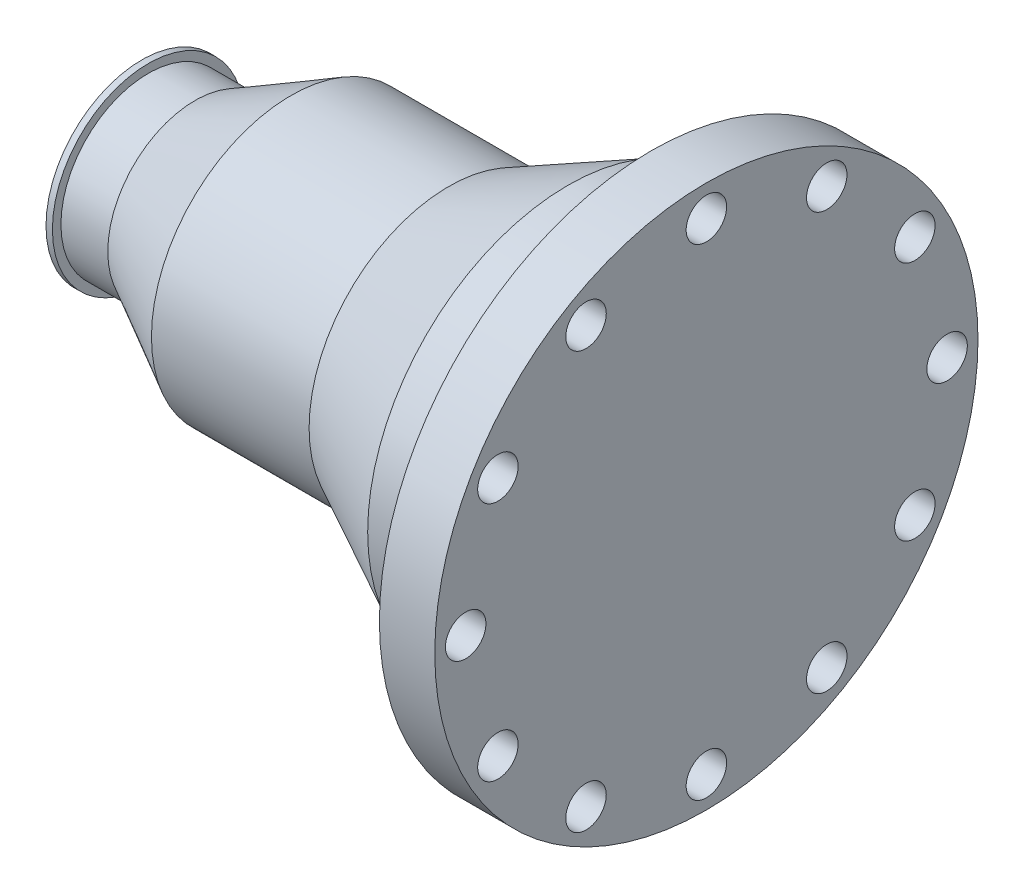
ISO-10303-21;
HEADER;
FILE_DESCRIPTION(('STEP AP214'),'2;1');
FILE_NAME('part.step','',(''),(''),'','','');
FILE_SCHEMA(('AUTOMOTIVE_DESIGN { 1 0 10303 214 1 1 1 1 }'));
ENDSEC;
DATA;
#1=APPLICATION_CONTEXT('core data for automotive mechanical design processes');
#2=APPLICATION_PROTOCOL_DEFINITION('international standard','automotive_design',2000,#1);
#3=PRODUCT_CONTEXT('',#1,'mechanical');
#4=PRODUCT('Part','Part','',(#3));
#5=PRODUCT_RELATED_PRODUCT_CATEGORY('part','',(#4));
#6=PRODUCT_DEFINITION_FORMATION('','',#4);
#7=PRODUCT_DEFINITION_CONTEXT('part definition',#1,'design');
#8=PRODUCT_DEFINITION('design','',#6,#7);
#9=PRODUCT_DEFINITION_SHAPE('','',#8);
#10=(LENGTH_UNIT() NAMED_UNIT(*) SI_UNIT(.MILLI.,.METRE.));
#11=(NAMED_UNIT(*) PLANE_ANGLE_UNIT() SI_UNIT($,.RADIAN.));
#12=(NAMED_UNIT(*) SI_UNIT($,.STERADIAN.) SOLID_ANGLE_UNIT());
#13=UNCERTAINTY_MEASURE_WITH_UNIT(LENGTH_MEASURE(1.E-05),#10,'distance_accuracy_value','');
#14=(GEOMETRIC_REPRESENTATION_CONTEXT(3) GLOBAL_UNCERTAINTY_ASSIGNED_CONTEXT((#13)) GLOBAL_UNIT_ASSIGNED_CONTEXT((#10,
#11,#12)) REPRESENTATION_CONTEXT('',''));
#15=CARTESIAN_POINT('',(0.,0.,0.));
#16=DIRECTION('',(0.,0.,1.));
#17=DIRECTION('',(1.,0.,0.));
#18=AXIS2_PLACEMENT_3D('',#15,#16,#17);
#19=CARTESIAN_POINT('',(0.,0.,0.));
#20=DIRECTION('',(1.,0.,0.));
#21=DIRECTION('',(0.,0.,-1.));
#22=AXIS2_PLACEMENT_3D('',#19,#20,#21);
#23=PLANE('',#22);
#24=CARTESIAN_POINT('',(0.,0.,0.));
#25=DIRECTION('',(-1.,0.,0.));
#26=DIRECTION('',(0.,0.,1.));
#27=AXIS2_PLACEMENT_3D('',#24,#25,#26);
#28=CIRCLE('',#27,31.);
#29=CARTESIAN_POINT('',(0.,0.,31.));
#30=VERTEX_POINT('',#29);
#31=EDGE_CURVE('E80',#30,#30,#28,.T.);
#32=ORIENTED_EDGE('',*,*,#31,.F.);
#33=EDGE_LOOP('',(#32));
#34=FACE_BOUND('',#33,.T.);
#35=CARTESIAN_POINT('',(0.,0.,0.));
#36=DIRECTION('',(-1.,0.,0.));
#37=DIRECTION('',(0.,0.,1.));
#38=AXIS2_PLACEMENT_3D('',#35,#36,#37);
#39=CIRCLE('',#38,45.);
#40=CARTESIAN_POINT('',(0.,0.,45.));
#41=VERTEX_POINT('',#40);
#42=EDGE_CURVE('E10',#41,#41,#39,.T.);
#43=ORIENTED_EDGE('',*,*,#42,.T.);
#44=EDGE_LOOP('',(#43));
#45=FACE_BOUND('',#44,.T.);
#46=ADVANCED_FACE('F37',(#34,#45),#23,.F.);
#47=CARTESIAN_POINT('',(0.,0.,0.));
#48=DIRECTION('',(-1.,0.,0.));
#49=DIRECTION('',(0.,0.,1.));
#50=AXIS2_PLACEMENT_3D('',#47,#48,#49);
#51=CYLINDRICAL_SURFACE('',#50,45.);
#52=ORIENTED_EDGE('',*,*,#42,.F.);
#53=EDGE_LOOP('',(#52));
#54=FACE_BOUND('',#53,.T.);
#55=CARTESIAN_POINT('',(3.,0.,0.));
#56=DIRECTION('',(-1.,0.,0.));
#57=DIRECTION('',(0.,0.,1.));
#58=AXIS2_PLACEMENT_3D('',#55,#56,#57);
#59=CIRCLE('',#58,45.);
#60=CARTESIAN_POINT('',(3.,0.,45.));
#61=VERTEX_POINT('',#60);
#62=EDGE_CURVE('E43',#61,#61,#59,.T.);
#63=ORIENTED_EDGE('',*,*,#62,.T.);
#64=EDGE_LOOP('',(#63));
#65=FACE_BOUND('',#64,.T.);
#66=ADVANCED_FACE('F244',(#54,#65),#51,.T.);
#67=CARTESIAN_POINT('',(3.,45.,0.));
#68=DIRECTION('',(-1.,0.,0.));
#69=DIRECTION('',(0.,0.,1.));
#70=AXIS2_PLACEMENT_3D('',#67,#68,#69);
#71=PLANE('',#70);
#72=ORIENTED_EDGE('',*,*,#62,.F.);
#73=EDGE_LOOP('',(#72));
#74=FACE_BOUND('',#73,.T.);
#75=CARTESIAN_POINT('',(3.,0.,0.));
#76=DIRECTION('',(-1.,0.,0.));
#77=DIRECTION('',(0.,0.,1.));
#78=AXIS2_PLACEMENT_3D('',#75,#76,#77);
#79=CIRCLE('',#78,41.);
#80=CARTESIAN_POINT('',(3.,0.,41.));
#81=VERTEX_POINT('',#80);
#82=EDGE_CURVE('E47',#81,#81,#79,.T.);
#83=ORIENTED_EDGE('',*,*,#82,.T.);
#84=EDGE_LOOP('',(#83));
#85=FACE_BOUND('',#84,.T.);
#86=ADVANCED_FACE('F250',(#74,#85),#71,.F.);
#87=CARTESIAN_POINT('',(0.,0.,0.));
#88=DIRECTION('',(-1.,0.,0.));
#89=DIRECTION('',(0.,0.,1.));
#90=AXIS2_PLACEMENT_3D('',#87,#88,#89);
#91=CYLINDRICAL_SURFACE('',#90,41.);
#92=ORIENTED_EDGE('',*,*,#82,.F.);
#93=EDGE_LOOP('',(#92));
#94=FACE_BOUND('',#93,.T.);
#95=CARTESIAN_POINT('',(25.,0.,0.));
#96=DIRECTION('',(-1.,0.,0.));
#97=DIRECTION('',(0.,0.,1.));
#98=AXIS2_PLACEMENT_3D('',#95,#96,#97);
#99=CIRCLE('',#98,41.);
#100=CARTESIAN_POINT('',(25.,0.,41.));
#101=VERTEX_POINT('',#100);
#102=EDGE_CURVE('E51',#101,#101,#99,.T.);
#103=ORIENTED_EDGE('',*,*,#102,.T.);
#104=EDGE_LOOP('',(#103));
#105=FACE_BOUND('',#104,.T.);
#106=ADVANCED_FACE('F604',(#94,#105),#91,.T.);
#107=CARTESIAN_POINT('',(70.,0.,0.));
#108=DIRECTION('',(1.,0.,0.));
#109=DIRECTION('',(0.,0.,-1.));
#110=AXIS2_PLACEMENT_3D('',#107,#108,#109);
#111=CONICAL_SURFACE('',#110,65.5,0.498567905638218);
#112=ORIENTED_EDGE('',*,*,#102,.F.);
#113=EDGE_LOOP('',(#112));
#114=FACE_BOUND('',#113,.T.);
#115=CARTESIAN_POINT('',(70.,0.,0.));
#116=DIRECTION('',(-1.,0.,0.));
#117=DIRECTION('',(0.,0.,1.));
#118=AXIS2_PLACEMENT_3D('',#115,#116,#117);
#119=CIRCLE('',#118,65.5);
#120=CARTESIAN_POINT('',(70.,0.,65.5));
#121=VERTEX_POINT('',#120);
#122=EDGE_CURVE('E56',#121,#121,#119,.T.);
#123=ORIENTED_EDGE('',*,*,#122,.T.);
#124=EDGE_LOOP('',(#123));
#125=FACE_BOUND('',#124,.T.);
#126=ADVANCED_FACE('F595',(#114,#125),#111,.T.);
#127=CARTESIAN_POINT('',(0.,0.,0.));
#128=DIRECTION('',(-1.,0.,0.));
#129=DIRECTION('',(0.,0.,1.));
#130=AXIS2_PLACEMENT_3D('',#127,#128,#129);
#131=CYLINDRICAL_SURFACE('',#130,65.5);
#132=ORIENTED_EDGE('',*,*,#122,.F.);
#133=EDGE_LOOP('',(#132));
#134=FACE_BOUND('',#133,.T.);
#135=CARTESIAN_POINT('',(144.,0.,0.));
#136=DIRECTION('',(-1.,0.,0.));
#137=DIRECTION('',(0.,0.,1.));
#138=AXIS2_PLACEMENT_3D('',#135,#136,#137);
#139=CIRCLE('',#138,65.5);
#140=CARTESIAN_POINT('',(144.,0.,65.5));
#141=VERTEX_POINT('',#140);
#142=EDGE_CURVE('E59',#141,#141,#139,.T.);
#143=ORIENTED_EDGE('',*,*,#142,.T.);
#144=EDGE_LOOP('',(#143));
#145=FACE_BOUND('',#144,.T.);
#146=ADVANCED_FACE('F586',(#134,#145),#131,.T.);
#147=CARTESIAN_POINT('',(200.,0.,0.));
#148=DIRECTION('',(1.,0.,0.));
#149=DIRECTION('',(0.,0.,-1.));
#150=AXIS2_PLACEMENT_3D('',#147,#148,#149);
#151=CONICAL_SURFACE('',#150,94.,0.470764926542016);
#152=ORIENTED_EDGE('',*,*,#142,.F.);
#153=EDGE_LOOP('',(#152));
#154=FACE_BOUND('',#153,.T.);
#155=CARTESIAN_POINT('',(200.,0.,0.));
#156=DIRECTION('',(-1.,0.,0.));
#157=DIRECTION('',(0.,0.,1.));
#158=AXIS2_PLACEMENT_3D('',#155,#156,#157);
#159=CIRCLE('',#158,94.);
#160=CARTESIAN_POINT('',(200.,0.,94.));
#161=VERTEX_POINT('',#160);
#162=EDGE_CURVE('E62',#161,#161,#159,.T.);
#163=ORIENTED_EDGE('',*,*,#162,.T.);
#164=EDGE_LOOP('',(#163));
#165=FACE_BOUND('',#164,.T.);
#166=ADVANCED_FACE('F577',(#154,#165),#151,.T.);
#167=CARTESIAN_POINT('',(0.,0.,0.));
#168=DIRECTION('',(-1.,0.,0.));
#169=DIRECTION('',(0.,0.,1.));
#170=AXIS2_PLACEMENT_3D('',#167,#168,#169);
#171=CYLINDRICAL_SURFACE('',#170,94.);
#172=ORIENTED_EDGE('',*,*,#162,.F.);
#173=EDGE_LOOP('',(#172));
#174=FACE_BOUND('',#173,.T.);
#175=CARTESIAN_POINT('',(220.,0.,0.));
#176=DIRECTION('',(-1.,0.,0.));
#177=DIRECTION('',(0.,0.,1.));
#178=AXIS2_PLACEMENT_3D('',#175,#176,#177);
#179=CIRCLE('',#178,94.);
#180=CARTESIAN_POINT('',(220.,0.,94.));
#181=VERTEX_POINT('',#180);
#182=EDGE_CURVE('E65',#181,#181,#179,.T.);
#183=ORIENTED_EDGE('',*,*,#182,.T.);
#184=EDGE_LOOP('',(#183));
#185=FACE_BOUND('',#184,.T.);
#186=ADVANCED_FACE('F568',(#174,#185),#171,.T.);
#187=CARTESIAN_POINT('',(220.,94.,0.));
#188=DIRECTION('',(1.,0.,0.));
#189=DIRECTION('',(0.,0.,-1.));
#190=AXIS2_PLACEMENT_3D('',#187,#188,#189);
#191=PLANE('',#190);
#192=ORIENTED_EDGE('',*,*,#182,.F.);
#193=EDGE_LOOP('',(#192));
#194=FACE_BOUND('',#193,.T.);
#195=CARTESIAN_POINT('',(220.,0.,0.));
#196=DIRECTION('',(-1.,0.,0.));
#197=DIRECTION('',(0.,0.,1.));
#198=AXIS2_PLACEMENT_3D('',#195,#196,#197);
#199=CIRCLE('',#198,95.);
#200=CARTESIAN_POINT('',(220.,0.,95.));
#201=VERTEX_POINT('',#200);
#202=EDGE_CURVE('E68',#201,#201,#199,.T.);
#203=ORIENTED_EDGE('',*,*,#202,.T.);
#204=EDGE_LOOP('',(#203));
#205=FACE_BOUND('',#204,.T.);
#206=ADVANCED_FACE('F559',(#194,#205),#191,.F.);
#207=CARTESIAN_POINT('',(0.,0.,0.));
#208=DIRECTION('',(-1.,0.,0.));
#209=DIRECTION('',(0.,0.,1.));
#210=AXIS2_PLACEMENT_3D('',#207,#208,#209);
#211=CYLINDRICAL_SURFACE('',#210,95.);
#212=ORIENTED_EDGE('',*,*,#202,.F.);
#213=EDGE_LOOP('',(#212));
#214=FACE_BOUND('',#213,.T.);
#215=CARTESIAN_POINT('',(239.,0.,0.));
#216=DIRECTION('',(-1.,0.,0.));
#217=DIRECTION('',(0.,0.,1.));
#218=AXIS2_PLACEMENT_3D('',#215,#216,#217);
#219=CIRCLE('',#218,95.);
#220=CARTESIAN_POINT('',(239.,0.,95.));
#221=VERTEX_POINT('',#220);
#222=EDGE_CURVE('E71',#221,#221,#219,.T.);
#223=ORIENTED_EDGE('',*,*,#222,.T.);
#224=EDGE_LOOP('',(#223));
#225=FACE_BOUND('',#224,.T.);
#226=ADVANCED_FACE('F240',(#214,#225),#211,.T.);
#227=CARTESIAN_POINT('',(239.,100.,0.));
#228=DIRECTION('',(1.,0.,0.));
#229=DIRECTION('',(0.,0.,-1.));
#230=AXIS2_PLACEMENT_3D('',#227,#228,#229);
#231=PLANE('',#230);
#232=CARTESIAN_POINT('',(239.,97.8608706276416,-56.5));
#233=DIRECTION('',(1.,0.,0.));
#234=DIRECTION('',(0.,0.,-1.));
#235=AXIS2_PLACEMENT_3D('',#232,#233,#234);
#236=CIRCLE('',#235,9.50000000000001);
#237=CARTESIAN_POINT('',(239.,97.8608706276416,-66.));
#238=VERTEX_POINT('',#237);
#239=EDGE_CURVE('E191',#238,#238,#236,.F.);
#240=ORIENTED_EDGE('',*,*,#239,.F.);
#241=EDGE_LOOP('',(#240));
#242=FACE_BOUND('',#241,.T.);
#243=CARTESIAN_POINT('',(239.,56.4999999999999,-97.8608706276416));
#244=DIRECTION('',(1.,0.,0.));
#245=DIRECTION('',(0.,0.,-1.));
#246=AXIS2_PLACEMENT_3D('',#243,#244,#245);
#247=CIRCLE('',#246,9.5);
#248=CARTESIAN_POINT('',(239.,56.4999999999999,-107.360870627642));
#249=VERTEX_POINT('',#248);
#250=EDGE_CURVE('E185',#249,#249,#247,.F.);
#251=ORIENTED_EDGE('',*,*,#250,.F.);
#252=EDGE_LOOP('',(#251));
#253=FACE_BOUND('',#252,.T.);
#254=CARTESIAN_POINT('',(239.,0.,-113.));
#255=DIRECTION('',(1.,0.,0.));
#256=DIRECTION('',(0.,0.,-1.));
#257=AXIS2_PLACEMENT_3D('',#254,#255,#256);
#258=CIRCLE('',#257,9.49999999999999);
#259=CARTESIAN_POINT('',(239.,0.,-122.5));
#260=VERTEX_POINT('',#259);
#261=EDGE_CURVE('E179',#260,#260,#258,.F.);
#262=ORIENTED_EDGE('',*,*,#261,.F.);
#263=EDGE_LOOP('',(#262));
#264=FACE_BOUND('',#263,.T.);
#265=CARTESIAN_POINT('',(239.,-56.5,-97.8608706276415));
#266=DIRECTION('',(1.,0.,0.));
#267=DIRECTION('',(0.,0.,-1.));
#268=AXIS2_PLACEMENT_3D('',#265,#266,#267);
#269=CIRCLE('',#268,9.5);
#270=CARTESIAN_POINT('',(239.,-56.5,-107.360870627642));
#271=VERTEX_POINT('',#270);
#272=EDGE_CURVE('E173',#271,#271,#269,.F.);
#273=ORIENTED_EDGE('',*,*,#272,.F.);
#274=EDGE_LOOP('',(#273));
#275=FACE_BOUND('',#274,.T.);
#276=CARTESIAN_POINT('',(239.,-97.8608706276416,-56.5));
#277=DIRECTION('',(1.,0.,0.));
#278=DIRECTION('',(0.,0.,-1.));
#279=AXIS2_PLACEMENT_3D('',#276,#277,#278);
#280=CIRCLE('',#279,9.50000000000001);
#281=CARTESIAN_POINT('',(239.,-97.8608706276416,-66.));
#282=VERTEX_POINT('',#281);
#283=EDGE_CURVE('E167',#282,#282,#280,.F.);
#284=ORIENTED_EDGE('',*,*,#283,.F.);
#285=EDGE_LOOP('',(#284));
#286=FACE_BOUND('',#285,.T.);
#287=CARTESIAN_POINT('',(239.,-113.,0.));
#288=DIRECTION('',(1.,0.,0.));
#289=DIRECTION('',(0.,0.,-1.));
#290=AXIS2_PLACEMENT_3D('',#287,#288,#289);
#291=CIRCLE('',#290,9.49999999999998);
#292=CARTESIAN_POINT('',(239.,-113.,-9.49999999999998));
#293=VERTEX_POINT('',#292);
#294=EDGE_CURVE('E161',#293,#293,#291,.F.);
#295=ORIENTED_EDGE('',*,*,#294,.F.);
#296=EDGE_LOOP('',(#295));
#297=FACE_BOUND('',#296,.T.);
#298=CARTESIAN_POINT('',(239.,-97.8608706276415,56.5));
#299=DIRECTION('',(1.,0.,0.));
#300=DIRECTION('',(0.,0.,-1.));
#301=AXIS2_PLACEMENT_3D('',#298,#299,#300);
#302=CIRCLE('',#301,9.5);
#303=CARTESIAN_POINT('',(239.,-97.8608706276415,47.));
#304=VERTEX_POINT('',#303);
#305=EDGE_CURVE('E155',#304,#304,#302,.F.);
#306=ORIENTED_EDGE('',*,*,#305,.F.);
#307=EDGE_LOOP('',(#306));
#308=FACE_BOUND('',#307,.T.);
#309=CARTESIAN_POINT('',(239.,-56.5,97.8608706276416));
#310=DIRECTION('',(1.,0.,0.));
#311=DIRECTION('',(0.,0.,-1.));
#312=AXIS2_PLACEMENT_3D('',#309,#310,#311);
#313=CIRCLE('',#312,9.5);
#314=CARTESIAN_POINT('',(239.,-56.5,88.3608706276416));
#315=VERTEX_POINT('',#314);
#316=EDGE_CURVE('E149',#315,#315,#313,.F.);
#317=ORIENTED_EDGE('',*,*,#316,.F.);
#318=EDGE_LOOP('',(#317));
#319=FACE_BOUND('',#318,.T.);
#320=CARTESIAN_POINT('',(239.,0.,113.));
#321=DIRECTION('',(1.,0.,0.));
#322=DIRECTION('',(0.,0.,-1.));
#323=AXIS2_PLACEMENT_3D('',#320,#321,#322);
#324=CIRCLE('',#323,9.49999999999999);
#325=CARTESIAN_POINT('',(239.,0.,103.5));
#326=VERTEX_POINT('',#325);
#327=EDGE_CURVE('E143',#326,#326,#324,.F.);
#328=ORIENTED_EDGE('',*,*,#327,.F.);
#329=EDGE_LOOP('',(#328));
#330=FACE_BOUND('',#329,.T.);
#331=CARTESIAN_POINT('',(239.,56.5,97.8608706276416));
#332=DIRECTION('',(1.,0.,0.));
#333=DIRECTION('',(0.,0.,-1.));
#334=AXIS2_PLACEMENT_3D('',#331,#332,#333);
#335=CIRCLE('',#334,9.5);
#336=CARTESIAN_POINT('',(239.,56.5,88.3608706276416));
#337=VERTEX_POINT('',#336);
#338=EDGE_CURVE('E137',#337,#337,#335,.F.);
#339=ORIENTED_EDGE('',*,*,#338,.F.);
#340=EDGE_LOOP('',(#339));
#341=FACE_BOUND('',#340,.T.);
#342=CARTESIAN_POINT('',(239.,97.8608706276416,56.5));
#343=DIRECTION('',(1.,0.,0.));
#344=DIRECTION('',(0.,0.,-1.));
#345=AXIS2_PLACEMENT_3D('',#342,#343,#344);
#346=CIRCLE('',#345,9.5);
#347=CARTESIAN_POINT('',(239.,97.8608706276416,47.));
#348=VERTEX_POINT('',#347);
#349=EDGE_CURVE('E131',#348,#348,#346,.F.);
#350=ORIENTED_EDGE('',*,*,#349,.F.);
#351=EDGE_LOOP('',(#350));
#352=FACE_BOUND('',#351,.T.);
#353=CARTESIAN_POINT('',(239.,113.,0.));
#354=DIRECTION('',(1.,0.,0.));
#355=DIRECTION('',(0.,0.,-1.));
#356=AXIS2_PLACEMENT_3D('',#353,#354,#355);
#357=CIRCLE('',#356,9.50000000000001);
#358=CARTESIAN_POINT('',(239.,113.,-9.50000000000001));
#359=VERTEX_POINT('',#358);
#360=EDGE_CURVE('E125',#359,#359,#357,.F.);
#361=ORIENTED_EDGE('',*,*,#360,.F.);
#362=EDGE_LOOP('',(#361));
#363=FACE_BOUND('',#362,.T.);
#364=ORIENTED_EDGE('',*,*,#222,.F.);
#365=EDGE_LOOP('',(#364));
#366=FACE_BOUND('',#365,.T.);
#367=CARTESIAN_POINT('',(239.,0.,0.));
#368=DIRECTION('',(-1.,0.,0.));
#369=DIRECTION('',(0.,0.,1.));
#370=AXIS2_PLACEMENT_3D('',#367,#368,#369);
#371=CIRCLE('',#370,127.5);
#372=CARTESIAN_POINT('',(239.,0.,127.5));
#373=VERTEX_POINT('',#372);
#374=EDGE_CURVE('E74',#373,#373,#371,.T.);
#375=ORIENTED_EDGE('',*,*,#374,.T.);
#376=EDGE_LOOP('',(#375));
#377=FACE_BOUND('',#376,.T.);
#378=ADVANCED_FACE('F232',(#242,#253,#264,#275,#286,#297,#308,#319,#330,#341,#352,#363,#366,
#377),#231,.F.);
#379=CARTESIAN_POINT('',(0.,0.,0.));
#380=DIRECTION('',(-1.,0.,0.));
#381=DIRECTION('',(0.,0.,1.));
#382=AXIS2_PLACEMENT_3D('',#379,#380,#381);
#383=CYLINDRICAL_SURFACE('',#382,127.5);
#384=ORIENTED_EDGE('',*,*,#374,.F.);
#385=EDGE_LOOP('',(#384));
#386=FACE_BOUND('',#385,.T.);
#387=CARTESIAN_POINT('',(265.,0.,0.));
#388=DIRECTION('',(-1.,0.,0.));
#389=DIRECTION('',(0.,0.,1.));
#390=AXIS2_PLACEMENT_3D('',#387,#388,#389);
#391=CIRCLE('',#390,127.5);
#392=CARTESIAN_POINT('',(265.,0.,127.5));
#393=VERTEX_POINT('',#392);
#394=EDGE_CURVE('E77',#393,#393,#391,.T.);
#395=ORIENTED_EDGE('',*,*,#394,.T.);
#396=EDGE_LOOP('',(#395));
#397=FACE_BOUND('',#396,.T.);
#398=ADVANCED_FACE('F205',(#386,#397),#383,.T.);
#399=CARTESIAN_POINT('',(265.,127.5,0.));
#400=DIRECTION('',(-1.,0.,0.));
#401=DIRECTION('',(0.,0.,1.));
#402=AXIS2_PLACEMENT_3D('',#399,#400,#401);
#403=PLANE('',#402);
#404=CARTESIAN_POINT('',(265.,97.8608706276416,-56.5));
#405=DIRECTION('',(1.,0.,0.));
#406=DIRECTION('',(0.,0.,-1.));
#407=AXIS2_PLACEMENT_3D('',#404,#405,#406);
#408=CIRCLE('',#407,9.50000000000001);
#409=CARTESIAN_POINT('',(265.,97.8608706276416,-66.));
#410=VERTEX_POINT('',#409);
#411=EDGE_CURVE('E194',#410,#410,#408,.T.);
#412=ORIENTED_EDGE('',*,*,#411,.F.);
#413=EDGE_LOOP('',(#412));
#414=FACE_BOUND('',#413,.T.);
#415=CARTESIAN_POINT('',(265.,56.4999999999999,-97.8608706276416));
#416=DIRECTION('',(1.,0.,0.));
#417=DIRECTION('',(0.,0.,-1.));
#418=AXIS2_PLACEMENT_3D('',#415,#416,#417);
#419=CIRCLE('',#418,9.5);
#420=CARTESIAN_POINT('',(265.,56.4999999999999,-107.360870627642));
#421=VERTEX_POINT('',#420);
#422=EDGE_CURVE('E188',#421,#421,#419,.T.);
#423=ORIENTED_EDGE('',*,*,#422,.F.);
#424=EDGE_LOOP('',(#423));
#425=FACE_BOUND('',#424,.T.);
#426=CARTESIAN_POINT('',(265.,0.,-113.));
#427=DIRECTION('',(1.,0.,0.));
#428=DIRECTION('',(0.,0.,-1.));
#429=AXIS2_PLACEMENT_3D('',#426,#427,#428);
#430=CIRCLE('',#429,9.49999999999999);
#431=CARTESIAN_POINT('',(265.,0.,-122.5));
#432=VERTEX_POINT('',#431);
#433=EDGE_CURVE('E182',#432,#432,#430,.T.);
#434=ORIENTED_EDGE('',*,*,#433,.F.);
#435=EDGE_LOOP('',(#434));
#436=FACE_BOUND('',#435,.T.);
#437=CARTESIAN_POINT('',(265.,-56.5,-97.8608706276415));
#438=DIRECTION('',(1.,0.,0.));
#439=DIRECTION('',(0.,0.,-1.));
#440=AXIS2_PLACEMENT_3D('',#437,#438,#439);
#441=CIRCLE('',#440,9.5);
#442=CARTESIAN_POINT('',(265.,-56.5,-107.360870627642));
#443=VERTEX_POINT('',#442);
#444=EDGE_CURVE('E176',#443,#443,#441,.T.);
#445=ORIENTED_EDGE('',*,*,#444,.F.);
#446=EDGE_LOOP('',(#445));
#447=FACE_BOUND('',#446,.T.);
#448=CARTESIAN_POINT('',(265.,-97.8608706276416,-56.5));
#449=DIRECTION('',(1.,0.,0.));
#450=DIRECTION('',(0.,0.,-1.));
#451=AXIS2_PLACEMENT_3D('',#448,#449,#450);
#452=CIRCLE('',#451,9.50000000000001);
#453=CARTESIAN_POINT('',(265.,-97.8608706276416,-66.));
#454=VERTEX_POINT('',#453);
#455=EDGE_CURVE('E170',#454,#454,#452,.T.);
#456=ORIENTED_EDGE('',*,*,#455,.F.);
#457=EDGE_LOOP('',(#456));
#458=FACE_BOUND('',#457,.T.);
#459=CARTESIAN_POINT('',(265.,-113.,0.));
#460=DIRECTION('',(1.,0.,0.));
#461=DIRECTION('',(0.,0.,-1.));
#462=AXIS2_PLACEMENT_3D('',#459,#460,#461);
#463=CIRCLE('',#462,9.49999999999998);
#464=CARTESIAN_POINT('',(265.,-113.,-9.49999999999998));
#465=VERTEX_POINT('',#464);
#466=EDGE_CURVE('E164',#465,#465,#463,.T.);
#467=ORIENTED_EDGE('',*,*,#466,.F.);
#468=EDGE_LOOP('',(#467));
#469=FACE_BOUND('',#468,.T.);
#470=CARTESIAN_POINT('',(265.,-97.8608706276415,56.5));
#471=DIRECTION('',(1.,0.,0.));
#472=DIRECTION('',(0.,0.,-1.));
#473=AXIS2_PLACEMENT_3D('',#470,#471,#472);
#474=CIRCLE('',#473,9.5);
#475=CARTESIAN_POINT('',(265.,-97.8608706276415,47.));
#476=VERTEX_POINT('',#475);
#477=EDGE_CURVE('E158',#476,#476,#474,.T.);
#478=ORIENTED_EDGE('',*,*,#477,.F.);
#479=EDGE_LOOP('',(#478));
#480=FACE_BOUND('',#479,.T.);
#481=CARTESIAN_POINT('',(265.,-56.5,97.8608706276416));
#482=DIRECTION('',(1.,0.,0.));
#483=DIRECTION('',(0.,0.,-1.));
#484=AXIS2_PLACEMENT_3D('',#481,#482,#483);
#485=CIRCLE('',#484,9.5);
#486=CARTESIAN_POINT('',(265.,-56.5,88.3608706276416));
#487=VERTEX_POINT('',#486);
#488=EDGE_CURVE('E152',#487,#487,#485,.T.);
#489=ORIENTED_EDGE('',*,*,#488,.F.);
#490=EDGE_LOOP('',(#489));
#491=FACE_BOUND('',#490,.T.);
#492=CARTESIAN_POINT('',(265.,0.,113.));
#493=DIRECTION('',(1.,0.,0.));
#494=DIRECTION('',(0.,0.,-1.));
#495=AXIS2_PLACEMENT_3D('',#492,#493,#494);
#496=CIRCLE('',#495,9.49999999999999);
#497=CARTESIAN_POINT('',(265.,0.,103.5));
#498=VERTEX_POINT('',#497);
#499=EDGE_CURVE('E146',#498,#498,#496,.T.);
#500=ORIENTED_EDGE('',*,*,#499,.F.);
#501=EDGE_LOOP('',(#500));
#502=FACE_BOUND('',#501,.T.);
#503=CARTESIAN_POINT('',(265.,56.5,97.8608706276416));
#504=DIRECTION('',(1.,0.,0.));
#505=DIRECTION('',(0.,0.,-1.));
#506=AXIS2_PLACEMENT_3D('',#503,#504,#505);
#507=CIRCLE('',#506,9.5);
#508=CARTESIAN_POINT('',(265.,56.5,88.3608706276416));
#509=VERTEX_POINT('',#508);
#510=EDGE_CURVE('E140',#509,#509,#507,.T.);
#511=ORIENTED_EDGE('',*,*,#510,.F.);
#512=EDGE_LOOP('',(#511));
#513=FACE_BOUND('',#512,.T.);
#514=CARTESIAN_POINT('',(265.,97.8608706276416,56.5));
#515=DIRECTION('',(1.,0.,0.));
#516=DIRECTION('',(0.,0.,-1.));
#517=AXIS2_PLACEMENT_3D('',#514,#515,#516);
#518=CIRCLE('',#517,9.5);
#519=CARTESIAN_POINT('',(265.,97.8608706276416,47.));
#520=VERTEX_POINT('',#519);
#521=EDGE_CURVE('E134',#520,#520,#518,.T.);
#522=ORIENTED_EDGE('',*,*,#521,.F.);
#523=EDGE_LOOP('',(#522));
#524=FACE_BOUND('',#523,.T.);
#525=CARTESIAN_POINT('',(265.,113.,0.));
#526=DIRECTION('',(1.,0.,0.));
#527=DIRECTION('',(0.,0.,-1.));
#528=AXIS2_PLACEMENT_3D('',#525,#526,#527);
#529=CIRCLE('',#528,9.50000000000001);
#530=CARTESIAN_POINT('',(265.,113.,-9.50000000000001));
#531=VERTEX_POINT('',#530);
#532=EDGE_CURVE('E128',#531,#531,#529,.T.);
#533=ORIENTED_EDGE('',*,*,#532,.F.);
#534=EDGE_LOOP('',(#533));
#535=FACE_BOUND('',#534,.T.);
#536=ORIENTED_EDGE('',*,*,#394,.F.);
#537=EDGE_LOOP('',(#536));
#538=FACE_BOUND('',#537,.T.);
#539=ADVANCED_FACE('F201',(#414,#425,#436,#447,#458,#469,#480,#491,#502,#513,#524,#535,#538),
#403,.F.);
#540=CARTESIAN_POINT('',(0.,0.,0.));
#541=DIRECTION('',(-1.,0.,0.));
#542=DIRECTION('',(0.,0.,1.));
#543=AXIS2_PLACEMENT_3D('',#540,#541,#542);
#544=CYLINDRICAL_SURFACE('',#543,31.);
#545=ORIENTED_EDGE('',*,*,#31,.T.);
#546=EDGE_LOOP('',(#545));
#547=FACE_BOUND('',#546,.T.);
#548=CARTESIAN_POINT('',(42.,0.,0.));
#549=DIRECTION('',(-1.,0.,0.));
#550=DIRECTION('',(0.,0.,1.));
#551=AXIS2_PLACEMENT_3D('',#548,#549,#550);
#552=CIRCLE('',#551,31.);
#553=CARTESIAN_POINT('',(42.,0.,31.));
#554=VERTEX_POINT('',#553);
#555=EDGE_CURVE('E83',#554,#554,#552,.T.);
#556=ORIENTED_EDGE('',*,*,#555,.F.);
#557=EDGE_LOOP('',(#556));
#558=FACE_BOUND('',#557,.T.);
#559=ADVANCED_FACE('F204',(#547,#558),#544,.F.);
#560=CARTESIAN_POINT('',(70.,0.,0.));
#561=DIRECTION('',(1.,0.,0.));
#562=DIRECTION('',(0.,0.,-1.));
#563=AXIS2_PLACEMENT_3D('',#560,#561,#562);
#564=CONICAL_SURFACE('',#563,38.502577,0.261799374867879);
#565=ORIENTED_EDGE('',*,*,#555,.T.);
#566=EDGE_LOOP('',(#565));
#567=FACE_BOUND('',#566,.T.);
#568=CARTESIAN_POINT('',(70.,0.,0.));
#569=DIRECTION('',(-1.,0.,0.));
#570=DIRECTION('',(0.,0.,1.));
#571=AXIS2_PLACEMENT_3D('',#568,#569,#570);
#572=CIRCLE('',#571,38.502577);
#573=CARTESIAN_POINT('',(70.,0.,38.502577));
#574=VERTEX_POINT('',#573);
#575=EDGE_CURVE('E86',#574,#574,#572,.T.);
#576=ORIENTED_EDGE('',*,*,#575,.F.);
#577=EDGE_LOOP('',(#576));
#578=FACE_BOUND('',#577,.T.);
#579=ADVANCED_FACE('F255',(#567,#578),#564,.F.);
#580=CARTESIAN_POINT('',(107.802202951022,0.,0.));
#581=DIRECTION('',(-1.,0.,0.));
#582=DIRECTION('',(0.,0.,1.));
#583=AXIS2_PLACEMENT_3D('',#580,#581,#582);
#584=DEGENERATE_TOROIDAL_SURFACE('',#583,5.77654352226822,49.9999981513586,.T.);
#585=ORIENTED_EDGE('',*,*,#575,.T.);
#586=EDGE_LOOP('',(#585));
#587=FACE_BOUND('',#586,.T.);
#588=CARTESIAN_POINT('',(90.,0.,0.));
#589=DIRECTION('',(-1.,0.,0.));
#590=DIRECTION('',(0.,0.,1.));
#591=AXIS2_PLACEMENT_3D('',#588,#589,#590);
#592=CIRCLE('',#591,52.5);
#593=CARTESIAN_POINT('',(90.,0.,52.5));
#594=VERTEX_POINT('',#593);
#595=EDGE_CURVE('E89',#594,#594,#592,.T.);
#596=ORIENTED_EDGE('',*,*,#595,.F.);
#597=EDGE_LOOP('',(#596));
#598=FACE_BOUND('',#597,.T.);
#599=ADVANCED_FACE('F261',(#587,#598),#584,.F.);
#600=CARTESIAN_POINT('',(0.,0.,0.));
#601=DIRECTION('',(-1.,0.,0.));
#602=DIRECTION('',(0.,0.,1.));
#603=AXIS2_PLACEMENT_3D('',#600,#601,#602);
#604=CYLINDRICAL_SURFACE('',#603,52.5);
#605=ORIENTED_EDGE('',*,*,#595,.T.);
#606=EDGE_LOOP('',(#605));
#607=FACE_BOUND('',#606,.T.);
#608=CARTESIAN_POINT('',(142.,0.,0.));
#609=DIRECTION('',(-1.,0.,0.));
#610=DIRECTION('',(0.,0.,1.));
#611=AXIS2_PLACEMENT_3D('',#608,#609,#610);
#612=CIRCLE('',#611,52.5);
#613=CARTESIAN_POINT('',(142.,0.,52.5));
#614=VERTEX_POINT('',#613);
#615=EDGE_CURVE('E92',#614,#614,#612,.T.);
#616=ORIENTED_EDGE('',*,*,#615,.F.);
#617=EDGE_LOOP('',(#616));
#618=FACE_BOUND('',#617,.T.);
#619=ADVANCED_FACE('F267',(#607,#618),#604,.F.);
#620=CARTESIAN_POINT('',(142.75,0.,0.));
#621=DIRECTION('',(-1.,0.,0.));
#622=DIRECTION('',(0.,0.,1.));
#623=AXIS2_PLACEMENT_3D('',#620,#621,#622);
#624=TOROIDAL_SURFACE('',#623,49.8031848031275,2.79916276877255);
#625=ORIENTED_EDGE('',*,*,#615,.T.);
#626=EDGE_LOOP('',(#625));
#627=FACE_BOUND('',#626,.T.);
#628=CARTESIAN_POINT('',(143.5,0.,0.));
#629=DIRECTION('',(-1.,0.,0.));
#630=DIRECTION('',(0.,0.,1.));
#631=AXIS2_PLACEMENT_3D('',#628,#629,#630);
#632=CIRCLE('',#631,52.5);
#633=CARTESIAN_POINT('',(143.5,0.,52.5));
#634=VERTEX_POINT('',#633);
#635=EDGE_CURVE('E95',#634,#634,#632,.T.);
#636=ORIENTED_EDGE('',*,*,#635,.F.);
#637=EDGE_LOOP('',(#636));
#638=FACE_BOUND('',#637,.T.);
#639=ADVANCED_FACE('F273',(#627,#638),#624,.F.);
#640=CARTESIAN_POINT('',(0.,0.,0.));
#641=DIRECTION('',(-1.,0.,0.));
#642=DIRECTION('',(0.,0.,1.));
#643=AXIS2_PLACEMENT_3D('',#640,#641,#642);
#644=CYLINDRICAL_SURFACE('',#643,52.5);
#645=ORIENTED_EDGE('',*,*,#635,.T.);
#646=EDGE_LOOP('',(#645));
#647=FACE_BOUND('',#646,.T.);
#648=CARTESIAN_POINT('',(146.669872,0.,0.));
#649=DIRECTION('',(-1.,0.,0.));
#650=DIRECTION('',(0.,0.,1.));
#651=AXIS2_PLACEMENT_3D('',#648,#649,#650);
#652=CIRCLE('',#651,52.5);
#653=CARTESIAN_POINT('',(146.669872,0.,52.5));
#654=VERTEX_POINT('',#653);
#655=EDGE_CURVE('E98',#654,#654,#652,.T.);
#656=ORIENTED_EDGE('',*,*,#655,.F.);
#657=EDGE_LOOP('',(#656));
#658=FACE_BOUND('',#657,.T.);
#659=ADVANCED_FACE('F279',(#647,#658),#644,.F.);
#660=CARTESIAN_POINT('',(147.593438045,0.,0.));
#661=DIRECTION('',(-1.,0.,0.));
#662=DIRECTION('',(0.,0.,1.));
#663=AXIS2_PLACEMENT_3D('',#660,#661,#662);
#664=TOROIDAL_SURFACE('',#663,53.580573582,1.42148285448445);
#665=ORIENTED_EDGE('',*,*,#655,.T.);
#666=EDGE_LOOP('',(#665));
#667=FACE_BOUND('',#666,.T.);
#668=CARTESIAN_POINT('',(147.669872,0.,0.));
#669=DIRECTION('',(-1.,0.,0.));
#670=DIRECTION('',(0.,0.,1.));
#671=AXIS2_PLACEMENT_3D('',#668,#669,#670);
#672=CIRCLE('',#671,55.);
#673=CARTESIAN_POINT('',(147.669872,0.,55.));
#674=VERTEX_POINT('',#673);
#675=EDGE_CURVE('E101',#674,#674,#672,.T.);
#676=ORIENTED_EDGE('',*,*,#675,.F.);
#677=EDGE_LOOP('',(#676));
#678=FACE_BOUND('',#677,.T.);
#679=ADVANCED_FACE('F285',(#667,#678),#664,.F.);
#680=CARTESIAN_POINT('',(0.,0.,0.));
#681=DIRECTION('',(-1.,0.,0.));
#682=DIRECTION('',(0.,0.,1.));
#683=AXIS2_PLACEMENT_3D('',#680,#681,#682);
#684=CYLINDRICAL_SURFACE('',#683,55.);
#685=ORIENTED_EDGE('',*,*,#675,.T.);
#686=EDGE_LOOP('',(#685));
#687=FACE_BOUND('',#686,.T.);
#688=CARTESIAN_POINT('',(200.,0.,0.));
#689=DIRECTION('',(-1.,0.,0.));
#690=DIRECTION('',(0.,0.,1.));
#691=AXIS2_PLACEMENT_3D('',#688,#689,#690);
#692=CIRCLE('',#691,55.);
#693=CARTESIAN_POINT('',(200.,0.,55.));
#694=VERTEX_POINT('',#693);
#695=EDGE_CURVE('E104',#694,#694,#692,.T.);
#696=ORIENTED_EDGE('',*,*,#695,.F.);
#697=EDGE_LOOP('',(#696));
#698=FACE_BOUND('',#697,.T.);
#699=ADVANCED_FACE('F291',(#687,#698),#684,.F.);
#700=CARTESIAN_POINT('',(200.,55.,0.));
#701=DIRECTION('',(-1.,0.,0.));
#702=DIRECTION('',(0.,0.,1.));
#703=AXIS2_PLACEMENT_3D('',#700,#701,#702);
#704=PLANE('',#703);
#705=ORIENTED_EDGE('',*,*,#695,.T.);
#706=EDGE_LOOP('',(#705));
#707=FACE_BOUND('',#706,.T.);
#708=CARTESIAN_POINT('',(200.,0.,0.));
#709=DIRECTION('',(-1.,0.,0.));
#710=DIRECTION('',(0.,0.,1.));
#711=AXIS2_PLACEMENT_3D('',#708,#709,#710);
#712=CIRCLE('',#711,38.502577);
#713=CARTESIAN_POINT('',(200.,0.,38.502577));
#714=VERTEX_POINT('',#713);
#715=EDGE_CURVE('E107',#714,#714,#712,.T.);
#716=ORIENTED_EDGE('',*,*,#715,.F.);
#717=EDGE_LOOP('',(#716));
#718=FACE_BOUND('',#717,.T.);
#719=ADVANCED_FACE('F297',(#707,#718),#704,.T.);
#720=CARTESIAN_POINT('',(0.,0.,0.));
#721=DIRECTION('',(-1.,0.,0.));
#722=DIRECTION('',(0.,0.,1.));
#723=AXIS2_PLACEMENT_3D('',#720,#721,#722);
#724=CYLINDRICAL_SURFACE('',#723,38.502577);
#725=ORIENTED_EDGE('',*,*,#715,.T.);
#726=EDGE_LOOP('',(#725));
#727=FACE_BOUND('',#726,.T.);
#728=CARTESIAN_POINT('',(220.,0.,0.));
#729=DIRECTION('',(-1.,0.,0.));
#730=DIRECTION('',(0.,0.,1.));
#731=AXIS2_PLACEMENT_3D('',#728,#729,#730);
#732=CIRCLE('',#731,38.502577);
#733=CARTESIAN_POINT('',(220.,0.,38.502577));
#734=VERTEX_POINT('',#733);
#735=EDGE_CURVE('E110',#734,#734,#732,.T.);
#736=ORIENTED_EDGE('',*,*,#735,.F.);
#737=EDGE_LOOP('',(#736));
#738=FACE_BOUND('',#737,.T.);
#739=ADVANCED_FACE('F303',(#727,#738),#724,.F.);
#740=CARTESIAN_POINT('',(220.,38.502577,0.));
#741=DIRECTION('',(1.,0.,0.));
#742=DIRECTION('',(0.,0.,-1.));
#743=AXIS2_PLACEMENT_3D('',#740,#741,#742);
#744=PLANE('',#743);
#745=ORIENTED_EDGE('',*,*,#735,.T.);
#746=EDGE_LOOP('',(#745));
#747=FACE_BOUND('',#746,.T.);
#748=CARTESIAN_POINT('',(220.,0.,0.));
#749=DIRECTION('',(-1.,0.,0.));
#750=DIRECTION('',(0.,0.,1.));
#751=AXIS2_PLACEMENT_3D('',#748,#749,#750);
#752=CIRCLE('',#751,47.);
#753=CARTESIAN_POINT('',(220.,0.,47.));
#754=VERTEX_POINT('',#753);
#755=EDGE_CURVE('E113',#754,#754,#752,.T.);
#756=ORIENTED_EDGE('',*,*,#755,.F.);
#757=EDGE_LOOP('',(#756));
#758=FACE_BOUND('',#757,.T.);
#759=ADVANCED_FACE('F309',(#747,#758),#744,.T.);
#760=CARTESIAN_POINT('',(0.,0.,0.));
#761=DIRECTION('',(-1.,0.,0.));
#762=DIRECTION('',(0.,0.,1.));
#763=AXIS2_PLACEMENT_3D('',#760,#761,#762);
#764=CYLINDRICAL_SURFACE('',#763,47.);
#765=ORIENTED_EDGE('',*,*,#755,.T.);
#766=EDGE_LOOP('',(#765));
#767=FACE_BOUND('',#766,.T.);
#768=CARTESIAN_POINT('',(239.,0.,0.));
#769=DIRECTION('',(-1.,0.,0.));
#770=DIRECTION('',(0.,0.,1.));
#771=AXIS2_PLACEMENT_3D('',#768,#769,#770);
#772=CIRCLE('',#771,47.);
#773=CARTESIAN_POINT('',(239.,0.,47.));
#774=VERTEX_POINT('',#773);
#775=EDGE_CURVE('E116',#774,#774,#772,.T.);
#776=ORIENTED_EDGE('',*,*,#775,.F.);
#777=EDGE_LOOP('',(#776));
#778=FACE_BOUND('',#777,.T.);
#779=ADVANCED_FACE('F315',(#767,#778),#764,.F.);
#780=CARTESIAN_POINT('',(239.,47.,0.));
#781=DIRECTION('',(-1.,0.,0.));
#782=DIRECTION('',(0.,0.,1.));
#783=AXIS2_PLACEMENT_3D('',#780,#781,#782);
#784=PLANE('',#783);
#785=ORIENTED_EDGE('',*,*,#775,.T.);
#786=EDGE_LOOP('',(#785));
#787=FACE_BOUND('',#786,.T.);
#788=CARTESIAN_POINT('',(239.,0.,0.));
#789=DIRECTION('',(-1.,0.,0.));
#790=DIRECTION('',(0.,0.,1.));
#791=AXIS2_PLACEMENT_3D('',#788,#789,#790);
#792=CIRCLE('',#791,34.);
#793=CARTESIAN_POINT('',(239.,0.,34.));
#794=VERTEX_POINT('',#793);
#795=EDGE_CURVE('E119',#794,#794,#792,.T.);
#796=ORIENTED_EDGE('',*,*,#795,.F.);
#797=EDGE_LOOP('',(#796));
#798=FACE_BOUND('',#797,.T.);
#799=ADVANCED_FACE('F321',(#787,#798),#784,.T.);
#800=CARTESIAN_POINT('',(0.,0.,0.));
#801=DIRECTION('',(-1.,0.,0.));
#802=DIRECTION('',(0.,0.,1.));
#803=AXIS2_PLACEMENT_3D('',#800,#801,#802);
#804=CYLINDRICAL_SURFACE('',#803,34.);
#805=ORIENTED_EDGE('',*,*,#795,.T.);
#806=EDGE_LOOP('',(#805));
#807=FACE_BOUND('',#806,.T.);
#808=CARTESIAN_POINT('',(257.,0.,0.));
#809=DIRECTION('',(-1.,0.,0.));
#810=DIRECTION('',(0.,0.,1.));
#811=AXIS2_PLACEMENT_3D('',#808,#809,#810);
#812=CIRCLE('',#811,34.);
#813=CARTESIAN_POINT('',(257.,0.,34.));
#814=VERTEX_POINT('',#813);
#815=EDGE_CURVE('E122',#814,#814,#812,.T.);
#816=ORIENTED_EDGE('',*,*,#815,.F.);
#817=EDGE_LOOP('',(#816));
#818=FACE_BOUND('',#817,.T.);
#819=ADVANCED_FACE('F327',(#807,#818),#804,.F.);
#820=CARTESIAN_POINT('',(257.,34.,0.));
#821=DIRECTION('',(-1.,0.,0.));
#822=DIRECTION('',(0.,0.,1.));
#823=AXIS2_PLACEMENT_3D('',#820,#821,#822);
#824=PLANE('',#823);
#825=ORIENTED_EDGE('',*,*,#815,.T.);
#826=EDGE_LOOP('',(#825));
#827=FACE_BOUND('',#826,.T.);
#828=ADVANCED_FACE('F333',(#827),#824,.T.);
#829=CARTESIAN_POINT('',(265.,113.,0.));
#830=DIRECTION('',(-1.,0.,0.));
#831=DIRECTION('',(0.,0.,1.));
#832=AXIS2_PLACEMENT_3D('',#829,#830,#831);
#833=CYLINDRICAL_SURFACE('',#832,9.50000000000001);
#834=ORIENTED_EDGE('',*,*,#532,.T.);
#835=EDGE_LOOP('',(#834));
#836=FACE_BOUND('',#835,.T.);
#837=ORIENTED_EDGE('',*,*,#360,.T.);
#838=EDGE_LOOP('',(#837));
#839=FACE_BOUND('',#838,.T.);
#840=ADVANCED_FACE('F338',(#836,#839),#833,.F.);
#841=CARTESIAN_POINT('',(265.,97.8608706276416,56.5));
#842=DIRECTION('',(-1.,0.,0.));
#843=DIRECTION('',(0.,0.,1.));
#844=AXIS2_PLACEMENT_3D('',#841,#842,#843);
#845=CYLINDRICAL_SURFACE('',#844,9.5);
#846=ORIENTED_EDGE('',*,*,#521,.T.);
#847=EDGE_LOOP('',(#846));
#848=FACE_BOUND('',#847,.T.);
#849=ORIENTED_EDGE('',*,*,#349,.T.);
#850=EDGE_LOOP('',(#849));
#851=FACE_BOUND('',#850,.T.);
#852=ADVANCED_FACE('F343',(#848,#851),#845,.F.);
#853=CARTESIAN_POINT('',(265.,56.5,97.8608706276416));
#854=DIRECTION('',(-1.,0.,0.));
#855=DIRECTION('',(0.,0.,1.));
#856=AXIS2_PLACEMENT_3D('',#853,#854,#855);
#857=CYLINDRICAL_SURFACE('',#856,9.5);
#858=ORIENTED_EDGE('',*,*,#510,.T.);
#859=EDGE_LOOP('',(#858));
#860=FACE_BOUND('',#859,.T.);
#861=ORIENTED_EDGE('',*,*,#338,.T.);
#862=EDGE_LOOP('',(#861));
#863=FACE_BOUND('',#862,.T.);
#864=ADVANCED_FACE('F349',(#860,#863),#857,.F.);
#865=CARTESIAN_POINT('',(265.,0.,113.));
#866=DIRECTION('',(-1.,0.,0.));
#867=DIRECTION('',(0.,0.,1.));
#868=AXIS2_PLACEMENT_3D('',#865,#866,#867);
#869=CYLINDRICAL_SURFACE('',#868,9.49999999999999);
#870=ORIENTED_EDGE('',*,*,#499,.T.);
#871=EDGE_LOOP('',(#870));
#872=FACE_BOUND('',#871,.T.);
#873=ORIENTED_EDGE('',*,*,#327,.T.);
#874=EDGE_LOOP('',(#873));
#875=FACE_BOUND('',#874,.T.);
#876=ADVANCED_FACE('F353',(#872,#875),#869,.F.);
#877=CARTESIAN_POINT('',(265.,-56.5,97.8608706276416));
#878=DIRECTION('',(-1.,0.,0.));
#879=DIRECTION('',(0.,0.,1.));
#880=AXIS2_PLACEMENT_3D('',#877,#878,#879);
#881=CYLINDRICAL_SURFACE('',#880,9.5);
#882=ORIENTED_EDGE('',*,*,#488,.T.);
#883=EDGE_LOOP('',(#882));
#884=FACE_BOUND('',#883,.T.);
#885=ORIENTED_EDGE('',*,*,#316,.T.);
#886=EDGE_LOOP('',(#885));
#887=FACE_BOUND('',#886,.T.);
#888=ADVANCED_FACE('F357',(#884,#887),#881,.F.);
#889=CARTESIAN_POINT('',(265.,-97.8608706276415,56.5));
#890=DIRECTION('',(-1.,0.,0.));
#891=DIRECTION('',(0.,0.,1.));
#892=AXIS2_PLACEMENT_3D('',#889,#890,#891);
#893=CYLINDRICAL_SURFACE('',#892,9.5);
#894=ORIENTED_EDGE('',*,*,#477,.T.);
#895=EDGE_LOOP('',(#894));
#896=FACE_BOUND('',#895,.T.);
#897=ORIENTED_EDGE('',*,*,#305,.T.);
#898=EDGE_LOOP('',(#897));
#899=FACE_BOUND('',#898,.T.);
#900=ADVANCED_FACE('F361',(#896,#899),#893,.F.);
#901=CARTESIAN_POINT('',(265.,-113.,0.));
#902=DIRECTION('',(-1.,0.,0.));
#903=DIRECTION('',(0.,0.,1.));
#904=AXIS2_PLACEMENT_3D('',#901,#902,#903);
#905=CYLINDRICAL_SURFACE('',#904,9.49999999999998);
#906=ORIENTED_EDGE('',*,*,#466,.T.);
#907=EDGE_LOOP('',(#906));
#908=FACE_BOUND('',#907,.T.);
#909=ORIENTED_EDGE('',*,*,#294,.T.);
#910=EDGE_LOOP('',(#909));
#911=FACE_BOUND('',#910,.T.);
#912=ADVANCED_FACE('F365',(#908,#911),#905,.F.);
#913=CARTESIAN_POINT('',(265.,-97.8608706276416,-56.5));
#914=DIRECTION('',(-1.,0.,0.));
#915=DIRECTION('',(0.,0.,1.));
#916=AXIS2_PLACEMENT_3D('',#913,#914,#915);
#917=CYLINDRICAL_SURFACE('',#916,9.50000000000001);
#918=ORIENTED_EDGE('',*,*,#455,.T.);
#919=EDGE_LOOP('',(#918));
#920=FACE_BOUND('',#919,.T.);
#921=ORIENTED_EDGE('',*,*,#283,.T.);
#922=EDGE_LOOP('',(#921));
#923=FACE_BOUND('',#922,.T.);
#924=ADVANCED_FACE('F369',(#920,#923),#917,.F.);
#925=CARTESIAN_POINT('',(265.,-56.5,-97.8608706276415));
#926=DIRECTION('',(-1.,0.,0.));
#927=DIRECTION('',(0.,0.,1.));
#928=AXIS2_PLACEMENT_3D('',#925,#926,#927);
#929=CYLINDRICAL_SURFACE('',#928,9.5);
#930=ORIENTED_EDGE('',*,*,#444,.T.);
#931=EDGE_LOOP('',(#930));
#932=FACE_BOUND('',#931,.T.);
#933=ORIENTED_EDGE('',*,*,#272,.T.);
#934=EDGE_LOOP('',(#933));
#935=FACE_BOUND('',#934,.T.);
#936=ADVANCED_FACE('F373',(#932,#935),#929,.F.);
#937=CARTESIAN_POINT('',(265.,0.,-113.));
#938=DIRECTION('',(-1.,0.,0.));
#939=DIRECTION('',(0.,0.,1.));
#940=AXIS2_PLACEMENT_3D('',#937,#938,#939);
#941=CYLINDRICAL_SURFACE('',#940,9.49999999999999);
#942=ORIENTED_EDGE('',*,*,#433,.T.);
#943=EDGE_LOOP('',(#942));
#944=FACE_BOUND('',#943,.T.);
#945=ORIENTED_EDGE('',*,*,#261,.T.);
#946=EDGE_LOOP('',(#945));
#947=FACE_BOUND('',#946,.T.);
#948=ADVANCED_FACE('F377',(#944,#947),#941,.F.);
#949=CARTESIAN_POINT('',(265.,56.4999999999999,-97.8608706276416));
#950=DIRECTION('',(-1.,0.,0.));
#951=DIRECTION('',(0.,0.,1.));
#952=AXIS2_PLACEMENT_3D('',#949,#950,#951);
#953=CYLINDRICAL_SURFACE('',#952,9.5);
#954=ORIENTED_EDGE('',*,*,#422,.T.);
#955=EDGE_LOOP('',(#954));
#956=FACE_BOUND('',#955,.T.);
#957=ORIENTED_EDGE('',*,*,#250,.T.);
#958=EDGE_LOOP('',(#957));
#959=FACE_BOUND('',#958,.T.);
#960=ADVANCED_FACE('F381',(#956,#959),#953,.F.);
#961=CARTESIAN_POINT('',(265.,97.8608706276416,-56.5));
#962=DIRECTION('',(-1.,0.,0.));
#963=DIRECTION('',(0.,0.,1.));
#964=AXIS2_PLACEMENT_3D('',#961,#962,#963);
#965=CYLINDRICAL_SURFACE('',#964,9.50000000000001);
#966=ORIENTED_EDGE('',*,*,#411,.T.);
#967=EDGE_LOOP('',(#966));
#968=FACE_BOUND('',#967,.T.);
#969=ORIENTED_EDGE('',*,*,#239,.T.);
#970=EDGE_LOOP('',(#969));
#971=FACE_BOUND('',#970,.T.);
#972=ADVANCED_FACE('F198',(#968,#971),#965,.F.);
#973=CLOSED_SHELL('',(#46,#66,#86,#106,#126,#146,#166,#186,#206,#226,#378,#398,#539,#559,#579,
#599,#619,#639,#659,#679,#699,#719,#739,#759,#779,#799,#819,#828,#840,#852,#864,#876,#888,#900,
#912,#924,#936,#948,#960,#972));
#974=MANIFOLD_SOLID_BREP('B2',#973);
#975=ADVANCED_BREP_SHAPE_REPRESENTATION('',(#18,#974),#14);
#976=SHAPE_DEFINITION_REPRESENTATION(#9,#975);
ENDSEC;
END-ISO-10303-21;
